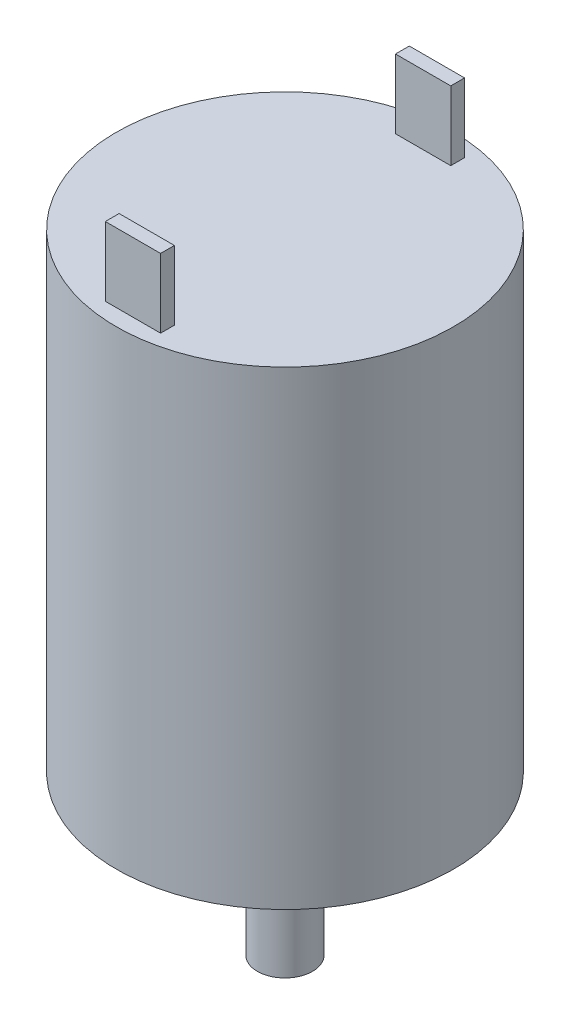
ISO-10303-21;
HEADER;
FILE_DESCRIPTION(('STEP AP214'),'2;1');
FILE_NAME('part.step','',(''),(''),'','','');
FILE_SCHEMA(('AUTOMOTIVE_DESIGN { 1 0 10303 214 1 1 1 1 }'));
ENDSEC;
DATA;
#1=APPLICATION_CONTEXT('core data for automotive mechanical design processes');
#2=APPLICATION_PROTOCOL_DEFINITION('international standard','automotive_design',2000,#1);
#3=PRODUCT_CONTEXT('',#1,'mechanical');
#4=PRODUCT('Part','Part','',(#3));
#5=PRODUCT_RELATED_PRODUCT_CATEGORY('part','',(#4));
#6=PRODUCT_DEFINITION_FORMATION('','',#4);
#7=PRODUCT_DEFINITION_CONTEXT('part definition',#1,'design');
#8=PRODUCT_DEFINITION('design','',#6,#7);
#9=PRODUCT_DEFINITION_SHAPE('','',#8);
#10=(LENGTH_UNIT() NAMED_UNIT(*) SI_UNIT(.MILLI.,.METRE.));
#11=(NAMED_UNIT(*) PLANE_ANGLE_UNIT() SI_UNIT($,.RADIAN.));
#12=(NAMED_UNIT(*) SI_UNIT($,.STERADIAN.) SOLID_ANGLE_UNIT());
#13=UNCERTAINTY_MEASURE_WITH_UNIT(LENGTH_MEASURE(1.E-05),#10,'distance_accuracy_value','');
#14=(GEOMETRIC_REPRESENTATION_CONTEXT(3) GLOBAL_UNCERTAINTY_ASSIGNED_CONTEXT((#13)) GLOBAL_UNIT_ASSIGNED_CONTEXT((#10,
#11,#12)) REPRESENTATION_CONTEXT('',''));
#15=CARTESIAN_POINT('',(0.,0.,0.));
#16=DIRECTION('',(0.,0.,1.));
#17=DIRECTION('',(1.,0.,0.));
#18=AXIS2_PLACEMENT_3D('',#15,#16,#17);
#19=CARTESIAN_POINT('',(0.,0.,0.));
#20=DIRECTION('',(0.,1.,0.));
#21=DIRECTION('',(0.,0.,1.));
#22=AXIS2_PLACEMENT_3D('',#19,#20,#21);
#23=PLANE('',#22);
#24=CARTESIAN_POINT('',(0.,0.,0.));
#25=DIRECTION('',(0.,-1.,0.));
#26=DIRECTION('',(0.,0.,-1.));
#27=AXIS2_PLACEMENT_3D('',#24,#25,#26);
#28=CIRCLE('',#27,12.2);
#29=CARTESIAN_POINT('',(0.,0.,-12.2));
#30=VERTEX_POINT('',#29);
#31=EDGE_CURVE('E11',#30,#30,#28,.T.);
#32=ORIENTED_EDGE('',*,*,#31,.F.);
#33=EDGE_LOOP('',(#32));
#34=FACE_BOUND('',#33,.T.);
#35=DIRECTION('',(1.,0.,0.));
#36=VECTOR('',#35,1.);
#37=CARTESIAN_POINT('',(-2.,0.,11.));
#38=LINE('',#37,#36);
#39=CARTESIAN_POINT('',(-2.,0.,11.));
#40=VERTEX_POINT('',#39);
#41=CARTESIAN_POINT('',(2.,0.,11.));
#42=VERTEX_POINT('',#41);
#43=EDGE_CURVE('E127',#40,#42,#38,.T.);
#44=ORIENTED_EDGE('',*,*,#43,.F.);
#45=DIRECTION('',(0.,0.,1.));
#46=VECTOR('',#45,1.);
#47=CARTESIAN_POINT('',(-2.,0.,11.));
#48=LINE('',#47,#46);
#49=CARTESIAN_POINT('',(-2.,0.,10.));
#50=VERTEX_POINT('',#49);
#51=EDGE_CURVE('E124',#50,#40,#48,.T.);
#52=ORIENTED_EDGE('',*,*,#51,.F.);
#53=DIRECTION('',(-1.,0.,0.));
#54=VECTOR('',#53,1.);
#55=CARTESIAN_POINT('',(-2.,0.,10.));
#56=LINE('',#55,#54);
#57=CARTESIAN_POINT('',(2.,0.,10.));
#58=VERTEX_POINT('',#57);
#59=EDGE_CURVE('E136',#58,#50,#56,.T.);
#60=ORIENTED_EDGE('',*,*,#59,.F.);
#61=DIRECTION('',(0.,0.,-1.));
#62=VECTOR('',#61,1.);
#63=CARTESIAN_POINT('',(2.,0.,11.));
#64=LINE('',#63,#62);
#65=EDGE_CURVE('E144',#42,#58,#64,.T.);
#66=ORIENTED_EDGE('',*,*,#65,.F.);
#67=EDGE_LOOP('',(#44,#52,#60,#66));
#68=FACE_BOUND('',#67,.T.);
#69=DIRECTION('',(0.,0.,1.));
#70=VECTOR('',#69,1.);
#71=CARTESIAN_POINT('',(-2.,0.,-11.));
#72=LINE('',#71,#70);
#73=CARTESIAN_POINT('',(-2.,0.,-11.));
#74=VERTEX_POINT('',#73);
#75=CARTESIAN_POINT('',(-2.,0.,-10.));
#76=VERTEX_POINT('',#75);
#77=EDGE_CURVE('E310',#74,#76,#72,.T.);
#78=ORIENTED_EDGE('',*,*,#77,.F.);
#79=DIRECTION('',(-1.,0.,0.));
#80=VECTOR('',#79,1.);
#81=CARTESIAN_POINT('',(-2.,0.,-11.));
#82=LINE('',#81,#80);
#83=CARTESIAN_POINT('',(2.,0.,-11.));
#84=VERTEX_POINT('',#83);
#85=EDGE_CURVE('E122',#84,#74,#82,.T.);
#86=ORIENTED_EDGE('',*,*,#85,.F.);
#87=DIRECTION('',(0.,0.,-1.));
#88=VECTOR('',#87,1.);
#89=CARTESIAN_POINT('',(2.,0.,-11.));
#90=LINE('',#89,#88);
#91=CARTESIAN_POINT('',(2.,0.,-10.));
#92=VERTEX_POINT('',#91);
#93=EDGE_CURVE('E118',#92,#84,#90,.T.);
#94=ORIENTED_EDGE('',*,*,#93,.F.);
#95=DIRECTION('',(1.,0.,0.));
#96=VECTOR('',#95,1.);
#97=CARTESIAN_POINT('',(-2.,0.,-10.));
#98=LINE('',#97,#96);
#99=EDGE_CURVE('E307',#76,#92,#98,.T.);
#100=ORIENTED_EDGE('',*,*,#99,.F.);
#101=EDGE_LOOP('',(#78,#86,#94,#100));
#102=FACE_BOUND('',#101,.T.);
#103=ADVANCED_FACE('F34',(#34,#68,#102),#23,.T.);
#104=CARTESIAN_POINT('',(0.,-45.5,0.));
#105=DIRECTION('',(0.,-1.,0.));
#106=DIRECTION('',(0.,0.,-1.));
#107=AXIS2_PLACEMENT_3D('',#104,#105,#106);
#108=CYLINDRICAL_SURFACE('',#107,12.2);
#109=ORIENTED_EDGE('',*,*,#31,.T.);
#110=EDGE_LOOP('',(#109));
#111=FACE_BOUND('',#110,.T.);
#112=CARTESIAN_POINT('',(0.,-34.,0.));
#113=DIRECTION('',(0.,-1.,0.));
#114=DIRECTION('',(0.,0.,-1.));
#115=AXIS2_PLACEMENT_3D('',#112,#113,#114);
#116=CIRCLE('',#115,12.2);
#117=CARTESIAN_POINT('',(0.,-34.,-12.2));
#118=VERTEX_POINT('',#117);
#119=EDGE_CURVE('E41',#118,#118,#116,.T.);
#120=ORIENTED_EDGE('',*,*,#119,.F.);
#121=EDGE_LOOP('',(#120));
#122=FACE_BOUND('',#121,.T.);
#123=ADVANCED_FACE('F166',(#111,#122),#108,.T.);
#124=CARTESIAN_POINT('',(12.2,-34.,0.));
#125=DIRECTION('',(0.,-1.,0.));
#126=DIRECTION('',(0.,0.,-1.));
#127=AXIS2_PLACEMENT_3D('',#124,#125,#126);
#128=PLANE('',#127);
#129=ORIENTED_EDGE('',*,*,#119,.T.);
#130=EDGE_LOOP('',(#129));
#131=FACE_BOUND('',#130,.T.);
#132=CARTESIAN_POINT('',(0.,-34.,0.));
#133=DIRECTION('',(0.,-1.,0.));
#134=DIRECTION('',(0.,0.,-1.));
#135=AXIS2_PLACEMENT_3D('',#132,#133,#134);
#136=CIRCLE('',#135,2.);
#137=CARTESIAN_POINT('',(0.,-34.,-2.));
#138=VERTEX_POINT('',#137);
#139=EDGE_CURVE('E158',#138,#138,#136,.T.);
#140=ORIENTED_EDGE('',*,*,#139,.F.);
#141=EDGE_LOOP('',(#140));
#142=FACE_BOUND('',#141,.T.);
#143=ADVANCED_FACE('F163',(#131,#142),#128,.T.);
#144=CARTESIAN_POINT('',(0.,-45.5,0.));
#145=DIRECTION('',(0.,-1.,0.));
#146=DIRECTION('',(0.,0.,-1.));
#147=AXIS2_PLACEMENT_3D('',#144,#145,#146);
#148=CYLINDRICAL_SURFACE('',#147,2.);
#149=ORIENTED_EDGE('',*,*,#139,.T.);
#150=EDGE_LOOP('',(#149));
#151=FACE_BOUND('',#150,.T.);
#152=CARTESIAN_POINT('',(0.,-45.5,0.));
#153=DIRECTION('',(0.,-1.,0.));
#154=DIRECTION('',(0.,0.,-1.));
#155=AXIS2_PLACEMENT_3D('',#152,#153,#154);
#156=CIRCLE('',#155,2.);
#157=CARTESIAN_POINT('',(0.,-45.5,-2.));
#158=VERTEX_POINT('',#157);
#159=EDGE_CURVE('E155',#158,#158,#156,.T.);
#160=ORIENTED_EDGE('',*,*,#159,.F.);
#161=EDGE_LOOP('',(#160));
#162=FACE_BOUND('',#161,.T.);
#163=ADVANCED_FACE('F173',(#151,#162),#148,.T.);
#164=CARTESIAN_POINT('',(2.,-45.5,0.));
#165=DIRECTION('',(0.,-1.,0.));
#166=DIRECTION('',(0.,0.,-1.));
#167=AXIS2_PLACEMENT_3D('',#164,#165,#166);
#168=PLANE('',#167);
#169=ORIENTED_EDGE('',*,*,#159,.T.);
#170=EDGE_LOOP('',(#169));
#171=FACE_BOUND('',#170,.T.);
#172=ADVANCED_FACE('F179',(#171),#168,.T.);
#173=CARTESIAN_POINT('',(-2.,5.,11.));
#174=DIRECTION('',(1.,0.,0.));
#175=DIRECTION('',(0.,0.,-1.));
#176=AXIS2_PLACEMENT_3D('',#173,#174,#175);
#177=PLANE('',#176);
#178=ORIENTED_EDGE('',*,*,#51,.T.);
#179=DIRECTION('',(0.,-1.,0.));
#180=VECTOR('',#179,1.);
#181=CARTESIAN_POINT('',(-2.,5.,11.));
#182=LINE('',#181,#180);
#183=CARTESIAN_POINT('',(-2.,5.,11.));
#184=VERTEX_POINT('',#183);
#185=EDGE_CURVE('E153',#184,#40,#182,.T.);
#186=ORIENTED_EDGE('',*,*,#185,.F.);
#187=DIRECTION('',(0.,0.,1.));
#188=VECTOR('',#187,1.);
#189=CARTESIAN_POINT('',(-2.,5.,11.));
#190=LINE('',#189,#188);
#191=CARTESIAN_POINT('',(-2.,5.,10.));
#192=VERTEX_POINT('',#191);
#193=EDGE_CURVE('E132',#192,#184,#190,.T.);
#194=ORIENTED_EDGE('',*,*,#193,.F.);
#195=DIRECTION('',(0.,-1.,0.));
#196=VECTOR('',#195,1.);
#197=CARTESIAN_POINT('',(-2.,5.,10.));
#198=LINE('',#197,#196);
#199=EDGE_CURVE('E141',#192,#50,#198,.T.);
#200=ORIENTED_EDGE('',*,*,#199,.T.);
#201=EDGE_LOOP('',(#178,#186,#194,#200));
#202=FACE_BOUND('',#201,.T.);
#203=ADVANCED_FACE('F183',(#202),#177,.F.);
#204=CARTESIAN_POINT('',(-2.,5.,11.));
#205=DIRECTION('',(0.,0.,-1.));
#206=DIRECTION('',(-1.,0.,0.));
#207=AXIS2_PLACEMENT_3D('',#204,#205,#206);
#208=PLANE('',#207);
#209=ORIENTED_EDGE('',*,*,#43,.T.);
#210=DIRECTION('',(0.,-1.,0.));
#211=VECTOR('',#210,1.);
#212=CARTESIAN_POINT('',(2.,5.,11.));
#213=LINE('',#212,#211);
#214=CARTESIAN_POINT('',(2.,5.,11.));
#215=VERTEX_POINT('',#214);
#216=EDGE_CURVE('E150',#215,#42,#213,.T.);
#217=ORIENTED_EDGE('',*,*,#216,.F.);
#218=DIRECTION('',(1.,0.,0.));
#219=VECTOR('',#218,1.);
#220=CARTESIAN_POINT('',(-2.,5.,11.));
#221=LINE('',#220,#219);
#222=EDGE_CURVE('E135',#184,#215,#221,.T.);
#223=ORIENTED_EDGE('',*,*,#222,.F.);
#224=ORIENTED_EDGE('',*,*,#185,.T.);
#225=EDGE_LOOP('',(#209,#217,#223,#224));
#226=FACE_BOUND('',#225,.T.);
#227=ADVANCED_FACE('F187',(#226),#208,.F.);
#228=CARTESIAN_POINT('',(2.,5.,11.));
#229=DIRECTION('',(-1.,0.,0.));
#230=DIRECTION('',(0.,0.,1.));
#231=AXIS2_PLACEMENT_3D('',#228,#229,#230);
#232=PLANE('',#231);
#233=ORIENTED_EDGE('',*,*,#65,.T.);
#234=DIRECTION('',(0.,-1.,0.));
#235=VECTOR('',#234,1.);
#236=CARTESIAN_POINT('',(2.,5.,10.));
#237=LINE('',#236,#235);
#238=CARTESIAN_POINT('',(2.,5.,10.));
#239=VERTEX_POINT('',#238);
#240=EDGE_CURVE('E56',#239,#58,#237,.T.);
#241=ORIENTED_EDGE('',*,*,#240,.F.);
#242=DIRECTION('',(0.,0.,-1.));
#243=VECTOR('',#242,1.);
#244=CARTESIAN_POINT('',(2.,5.,11.));
#245=LINE('',#244,#243);
#246=EDGE_CURVE('E138',#215,#239,#245,.T.);
#247=ORIENTED_EDGE('',*,*,#246,.F.);
#248=ORIENTED_EDGE('',*,*,#216,.T.);
#249=EDGE_LOOP('',(#233,#241,#247,#248));
#250=FACE_BOUND('',#249,.T.);
#251=ADVANCED_FACE('F191',(#250),#232,.F.);
#252=CARTESIAN_POINT('',(-2.,5.,10.));
#253=DIRECTION('',(0.,0.,1.));
#254=DIRECTION('',(1.,0.,0.));
#255=AXIS2_PLACEMENT_3D('',#252,#253,#254);
#256=PLANE('',#255);
#257=ORIENTED_EDGE('',*,*,#59,.T.);
#258=ORIENTED_EDGE('',*,*,#199,.F.);
#259=DIRECTION('',(-1.,0.,0.));
#260=VECTOR('',#259,1.);
#261=CARTESIAN_POINT('',(-2.,5.,10.));
#262=LINE('',#261,#260);
#263=EDGE_CURVE('E140',#239,#192,#262,.T.);
#264=ORIENTED_EDGE('',*,*,#263,.F.);
#265=ORIENTED_EDGE('',*,*,#240,.T.);
#266=EDGE_LOOP('',(#257,#258,#264,#265));
#267=FACE_BOUND('',#266,.T.);
#268=ADVANCED_FACE('F195',(#267),#256,.F.);
#269=CARTESIAN_POINT('',(0.,5.,0.));
#270=DIRECTION('',(0.,-1.,0.));
#271=DIRECTION('',(0.,0.,-1.));
#272=AXIS2_PLACEMENT_3D('',#269,#270,#271);
#273=PLANE('',#272);
#274=ORIENTED_EDGE('',*,*,#193,.T.);
#275=ORIENTED_EDGE('',*,*,#222,.T.);
#276=ORIENTED_EDGE('',*,*,#246,.T.);
#277=ORIENTED_EDGE('',*,*,#263,.T.);
#278=EDGE_LOOP('',(#274,#275,#276,#277));
#279=FACE_BOUND('',#278,.T.);
#280=ADVANCED_FACE('F199',(#279),#273,.F.);
#281=CARTESIAN_POINT('',(-2.,5.,-11.));
#282=DIRECTION('',(0.,0.,1.));
#283=DIRECTION('',(1.,0.,0.));
#284=AXIS2_PLACEMENT_3D('',#281,#282,#283);
#285=PLANE('',#284);
#286=ORIENTED_EDGE('',*,*,#85,.T.);
#287=DIRECTION('',(0.,-1.,0.));
#288=VECTOR('',#287,1.);
#289=CARTESIAN_POINT('',(-2.,5.,-11.));
#290=LINE('',#289,#288);
#291=CARTESIAN_POINT('',(-2.,5.,-11.));
#292=VERTEX_POINT('',#291);
#293=EDGE_CURVE('E103',#292,#74,#290,.T.);
#294=ORIENTED_EDGE('',*,*,#293,.F.);
#295=DIRECTION('',(-1.,0.,0.));
#296=VECTOR('',#295,1.);
#297=CARTESIAN_POINT('',(-2.,5.,-11.));
#298=LINE('',#297,#296);
#299=CARTESIAN_POINT('',(2.,5.,-11.));
#300=VERTEX_POINT('',#299);
#301=EDGE_CURVE('E110',#300,#292,#298,.T.);
#302=ORIENTED_EDGE('',*,*,#301,.F.);
#303=DIRECTION('',(0.,-1.,0.));
#304=VECTOR('',#303,1.);
#305=CARTESIAN_POINT('',(2.,5.,-11.));
#306=LINE('',#305,#304);
#307=EDGE_CURVE('E304',#300,#84,#306,.T.);
#308=ORIENTED_EDGE('',*,*,#307,.T.);
#309=EDGE_LOOP('',(#286,#294,#302,#308));
#310=FACE_BOUND('',#309,.T.);
#311=ADVANCED_FACE('F120',(#310),#285,.F.);
#312=CARTESIAN_POINT('',(-2.,5.,-11.));
#313=DIRECTION('',(1.,0.,0.));
#314=DIRECTION('',(0.,0.,-1.));
#315=AXIS2_PLACEMENT_3D('',#312,#313,#314);
#316=PLANE('',#315);
#317=ORIENTED_EDGE('',*,*,#77,.T.);
#318=DIRECTION('',(0.,-1.,0.));
#319=VECTOR('',#318,1.);
#320=CARTESIAN_POINT('',(-2.,5.,-10.));
#321=LINE('',#320,#319);
#322=CARTESIAN_POINT('',(-2.,5.,-10.));
#323=VERTEX_POINT('',#322);
#324=EDGE_CURVE('E106',#323,#76,#321,.T.);
#325=ORIENTED_EDGE('',*,*,#324,.F.);
#326=DIRECTION('',(0.,0.,1.));
#327=VECTOR('',#326,1.);
#328=CARTESIAN_POINT('',(-2.,5.,-11.));
#329=LINE('',#328,#327);
#330=EDGE_CURVE('E99',#292,#323,#329,.T.);
#331=ORIENTED_EDGE('',*,*,#330,.F.);
#332=ORIENTED_EDGE('',*,*,#293,.T.);
#333=EDGE_LOOP('',(#317,#325,#331,#332));
#334=FACE_BOUND('',#333,.T.);
#335=ADVANCED_FACE('F101',(#334),#316,.F.);
#336=CARTESIAN_POINT('',(-2.,5.,-10.));
#337=DIRECTION('',(0.,0.,-1.));
#338=DIRECTION('',(-1.,0.,0.));
#339=AXIS2_PLACEMENT_3D('',#336,#337,#338);
#340=PLANE('',#339);
#341=ORIENTED_EDGE('',*,*,#99,.T.);
#342=DIRECTION('',(0.,-1.,0.));
#343=VECTOR('',#342,1.);
#344=CARTESIAN_POINT('',(2.,5.,-10.));
#345=LINE('',#344,#343);
#346=CARTESIAN_POINT('',(2.,5.,-10.));
#347=VERTEX_POINT('',#346);
#348=EDGE_CURVE('E48',#347,#92,#345,.T.);
#349=ORIENTED_EDGE('',*,*,#348,.F.);
#350=DIRECTION('',(1.,0.,0.));
#351=VECTOR('',#350,1.);
#352=CARTESIAN_POINT('',(-2.,5.,-10.));
#353=LINE('',#352,#351);
#354=EDGE_CURVE('E109',#323,#347,#353,.T.);
#355=ORIENTED_EDGE('',*,*,#354,.F.);
#356=ORIENTED_EDGE('',*,*,#324,.T.);
#357=EDGE_LOOP('',(#341,#349,#355,#356));
#358=FACE_BOUND('',#357,.T.);
#359=ADVANCED_FACE('F207',(#358),#340,.F.);
#360=CARTESIAN_POINT('',(2.,5.,-11.));
#361=DIRECTION('',(-1.,0.,0.));
#362=DIRECTION('',(0.,0.,1.));
#363=AXIS2_PLACEMENT_3D('',#360,#361,#362);
#364=PLANE('',#363);
#365=ORIENTED_EDGE('',*,*,#93,.T.);
#366=ORIENTED_EDGE('',*,*,#307,.F.);
#367=DIRECTION('',(0.,0.,-1.));
#368=VECTOR('',#367,1.);
#369=CARTESIAN_POINT('',(2.,5.,-11.));
#370=LINE('',#369,#368);
#371=EDGE_CURVE('E114',#347,#300,#370,.T.);
#372=ORIENTED_EDGE('',*,*,#371,.F.);
#373=ORIENTED_EDGE('',*,*,#348,.T.);
#374=EDGE_LOOP('',(#365,#366,#372,#373));
#375=FACE_BOUND('',#374,.T.);
#376=ADVANCED_FACE('F210',(#375),#364,.F.);
#377=CARTESIAN_POINT('',(0.,5.,0.));
#378=DIRECTION('',(0.,-1.,0.));
#379=DIRECTION('',(0.,0.,-1.));
#380=AXIS2_PLACEMENT_3D('',#377,#378,#379);
#381=PLANE('',#380);
#382=ORIENTED_EDGE('',*,*,#301,.T.);
#383=ORIENTED_EDGE('',*,*,#330,.T.);
#384=ORIENTED_EDGE('',*,*,#354,.T.);
#385=ORIENTED_EDGE('',*,*,#371,.T.);
#386=EDGE_LOOP('',(#382,#383,#384,#385));
#387=FACE_BOUND('',#386,.T.);
#388=ADVANCED_FACE('F113',(#387),#381,.F.);
#389=CLOSED_SHELL('',(#103,#123,#143,#163,#172,#203,#227,#251,#268,#280,#311,#335,#359,#376,#388));
#390=MANIFOLD_SOLID_BREP('B2',#389);
#391=ADVANCED_BREP_SHAPE_REPRESENTATION('',(#18,#390),#14);
#392=SHAPE_DEFINITION_REPRESENTATION(#9,#391);
ENDSEC;
END-ISO-10303-21;
